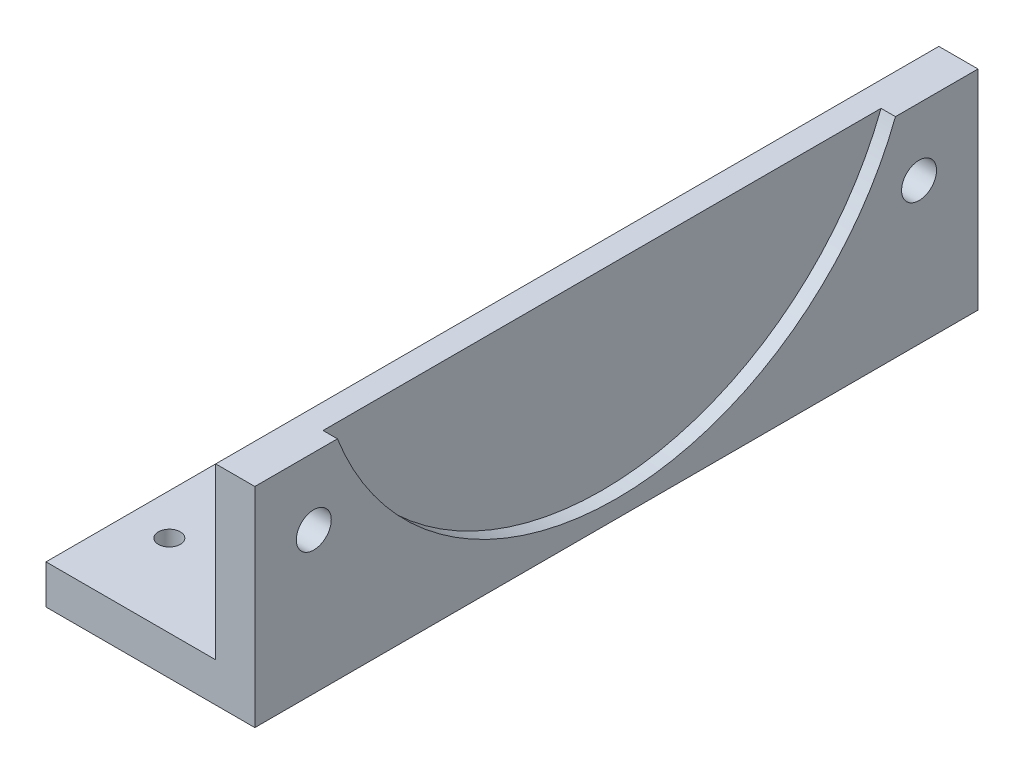
ISO-10303-21;
HEADER;
FILE_DESCRIPTION(('STEP AP214'),'2;1');
FILE_NAME('part.step','',(''),(''),'','','');
FILE_SCHEMA(('AUTOMOTIVE_DESIGN { 1 0 10303 214 1 1 1 1 }'));
ENDSEC;
DATA;
#1=APPLICATION_CONTEXT('core data for automotive mechanical design processes');
#2=APPLICATION_PROTOCOL_DEFINITION('international standard','automotive_design',2000,#1);
#3=PRODUCT_CONTEXT('',#1,'mechanical');
#4=PRODUCT('Part','Part','',(#3));
#5=PRODUCT_RELATED_PRODUCT_CATEGORY('part','',(#4));
#6=PRODUCT_DEFINITION_FORMATION('','',#4);
#7=PRODUCT_DEFINITION_CONTEXT('part definition',#1,'design');
#8=PRODUCT_DEFINITION('design','',#6,#7);
#9=PRODUCT_DEFINITION_SHAPE('','',#8);
#10=(LENGTH_UNIT() NAMED_UNIT(*) SI_UNIT(.MILLI.,.METRE.));
#11=(NAMED_UNIT(*) PLANE_ANGLE_UNIT() SI_UNIT($,.RADIAN.));
#12=(NAMED_UNIT(*) SI_UNIT($,.STERADIAN.) SOLID_ANGLE_UNIT());
#13=UNCERTAINTY_MEASURE_WITH_UNIT(LENGTH_MEASURE(1.E-05),#10,'distance_accuracy_value','');
#14=(GEOMETRIC_REPRESENTATION_CONTEXT(3) GLOBAL_UNCERTAINTY_ASSIGNED_CONTEXT((#13)) GLOBAL_UNIT_ASSIGNED_CONTEXT((#10,
#11,#12)) REPRESENTATION_CONTEXT('',''));
#15=CARTESIAN_POINT('',(0.,0.,0.));
#16=DIRECTION('',(0.,0.,1.));
#17=DIRECTION('',(1.,0.,0.));
#18=AXIS2_PLACEMENT_3D('',#15,#16,#17);
#19=CARTESIAN_POINT('',(25.4,-25.4,190.));
#20=DIRECTION('',(-1.,0.,0.));
#21=DIRECTION('',(0.,0.,1.));
#22=AXIS2_PLACEMENT_3D('',#19,#20,#21);
#23=PLANE('',#22);
#24=CARTESIAN_POINT('',(25.4000000000001,9.0999999999995,168.612159321677));
#25=DIRECTION('',(1.,0.,0.));
#26=DIRECTION('',(0.,0.,-1.));
#27=AXIS2_PLACEMENT_3D('',#24,#25,#26);
#28=CIRCLE('',#27,4.25);
#29=CARTESIAN_POINT('',(25.4000000000001,9.0999999999995,164.362159321677));
#30=VERTEX_POINT('',#29);
#31=EDGE_CURVE('E221',#30,#30,#28,.T.);
#32=ORIENTED_EDGE('',*,*,#31,.F.);
#33=EDGE_LOOP('',(#32));
#34=FACE_BOUND('',#33,.T.);
#35=DIRECTION('',(0.,-1.,0.));
#36=VECTOR('',#35,1.);
#37=CARTESIAN_POINT('',(25.4,25.4,7.04999999999997));
#38=LINE('',#37,#36);
#39=CARTESIAN_POINT('',(25.4,25.4,7.04999999999997));
#40=VERTEX_POINT('',#39);
#41=CARTESIAN_POINT('',(25.4,-25.4,7.04999999999999));
#42=VERTEX_POINT('',#41);
#43=EDGE_CURVE('E60',#40,#42,#38,.T.);
#44=ORIENTED_EDGE('',*,*,#43,.F.);
#45=DIRECTION('',(0.,0.,-1.));
#46=VECTOR('',#45,1.);
#47=CARTESIAN_POINT('',(25.4000000000001,25.3999999999999,190.));
#48=LINE('',#47,#46);
#49=CARTESIAN_POINT('',(25.4,25.3999999999999,27.1315795085813));
#50=VERTEX_POINT('',#49);
#51=EDGE_CURVE('E128',#50,#40,#48,.T.);
#52=ORIENTED_EDGE('',*,*,#51,.F.);
#53=CARTESIAN_POINT('',(25.4,51.5999999999998,95.));
#54=DIRECTION('',(1.,0.,0.));
#55=DIRECTION('',(0.,0.,-1.));
#56=AXIS2_PLACEMENT_3D('',#53,#54,#55);
#57=CIRCLE('',#56,72.75);
#58=CARTESIAN_POINT('',(25.4000000000001,25.3999999999999,162.868420491418));
#59=VERTEX_POINT('',#58);
#60=EDGE_CURVE('E157',#59,#50,#57,.T.);
#61=ORIENTED_EDGE('',*,*,#60,.F.);
#62=CARTESIAN_POINT('',(25.4000000000001,25.3999999999999,182.95));
#63=VERTEX_POINT('',#62);
#64=EDGE_CURVE('E137',#63,#59,#48,.T.);
#65=ORIENTED_EDGE('',*,*,#64,.F.);
#66=DIRECTION('',(0.,1.,0.));
#67=VECTOR('',#66,1.);
#68=CARTESIAN_POINT('',(25.4000000000001,-25.4,182.95));
#69=LINE('',#68,#67);
#70=CARTESIAN_POINT('',(25.4000000000001,-25.4,182.95));
#71=VERTEX_POINT('',#70);
#72=EDGE_CURVE('E190',#71,#63,#69,.T.);
#73=ORIENTED_EDGE('',*,*,#72,.F.);
#74=DIRECTION('',(0.,0.,-1.));
#75=VECTOR('',#74,1.);
#76=CARTESIAN_POINT('',(25.4,-25.4,190.));
#77=LINE('',#76,#75);
#78=EDGE_CURVE('E131',#71,#42,#77,.T.);
#79=ORIENTED_EDGE('',*,*,#78,.T.);
#80=EDGE_LOOP('',(#44,#52,#61,#65,#73,#79));
#81=FACE_BOUND('',#80,.T.);
#82=CARTESIAN_POINT('',(25.4000000000001,9.10000000000052,21.3878406783223));
#83=DIRECTION('',(1.,0.,0.));
#84=DIRECTION('',(0.,0.,-1.));
#85=AXIS2_PLACEMENT_3D('',#82,#83,#84);
#86=CIRCLE('',#85,4.25);
#87=CARTESIAN_POINT('',(25.4000000000001,9.10000000000052,17.1378406783223));
#88=VERTEX_POINT('',#87);
#89=EDGE_CURVE('E214',#88,#88,#86,.T.);
#90=ORIENTED_EDGE('',*,*,#89,.F.);
#91=EDGE_LOOP('',(#90));
#92=FACE_BOUND('',#91,.T.);
#93=ADVANCED_FACE('F46',(#34,#81,#92),#23,.F.);
#94=CARTESIAN_POINT('',(15.875,25.3999999999999,190.));
#95=DIRECTION('',(0.,-1.,0.));
#96=DIRECTION('',(0.,0.,-1.));
#97=AXIS2_PLACEMENT_3D('',#94,#95,#96);
#98=PLANE('',#97);
#99=DIRECTION('',(1.,0.,0.));
#100=VECTOR('',#99,1.);
#101=CARTESIAN_POINT('',(15.8750000000001,25.3999999999999,7.04999999999996));
#102=LINE('',#101,#100);
#103=CARTESIAN_POINT('',(15.8750000000001,25.3999999999999,7.04999999999996));
#104=VERTEX_POINT('',#103);
#105=EDGE_CURVE('E113',#104,#40,#102,.T.);
#106=ORIENTED_EDGE('',*,*,#105,.F.);
#107=DIRECTION('',(0.,0.,-1.));
#108=VECTOR('',#107,1.);
#109=CARTESIAN_POINT('',(15.875,25.3999999999999,190.));
#110=LINE('',#109,#108);
#111=CARTESIAN_POINT('',(15.875,25.3999999999999,182.95));
#112=VERTEX_POINT('',#111);
#113=EDGE_CURVE('E138',#112,#104,#110,.T.);
#114=ORIENTED_EDGE('',*,*,#113,.F.);
#115=DIRECTION('',(-1.,0.,0.));
#116=VECTOR('',#115,1.);
#117=CARTESIAN_POINT('',(25.4000000000001,25.3999999999999,182.95));
#118=LINE('',#117,#116);
#119=EDGE_CURVE('E198',#63,#112,#118,.T.);
#120=ORIENTED_EDGE('',*,*,#119,.F.);
#121=ORIENTED_EDGE('',*,*,#64,.T.);
#122=DIRECTION('',(1.,0.,0.));
#123=VECTOR('',#122,1.);
#124=CARTESIAN_POINT('',(21.9,25.3999999999999,162.868420491418));
#125=LINE('',#124,#123);
#126=CARTESIAN_POINT('',(21.9,25.3999999999999,162.868420491418));
#127=VERTEX_POINT('',#126);
#128=EDGE_CURVE('E53',#59,#127,#125,.F.);
#129=ORIENTED_EDGE('',*,*,#128,.T.);
#130=DIRECTION('',(0.,0.,1.));
#131=VECTOR('',#130,1.);
#132=CARTESIAN_POINT('',(21.9,25.3999999999999,190.));
#133=LINE('',#132,#131);
#134=CARTESIAN_POINT('',(21.9,25.3999999999999,27.1315795085813));
#135=VERTEX_POINT('',#134);
#136=EDGE_CURVE('E141',#135,#127,#133,.T.);
#137=ORIENTED_EDGE('',*,*,#136,.F.);
#138=DIRECTION('',(1.,0.,0.));
#139=VECTOR('',#138,1.);
#140=CARTESIAN_POINT('',(21.9,25.3999999999999,27.1315795085813));
#141=LINE('',#140,#139);
#142=EDGE_CURVE('E11',#135,#50,#141,.T.);
#143=ORIENTED_EDGE('',*,*,#142,.T.);
#144=ORIENTED_EDGE('',*,*,#51,.T.);
#145=EDGE_LOOP('',(#106,#114,#120,#121,#129,#137,#143,#144));
#146=FACE_BOUND('',#145,.T.);
#147=ADVANCED_FACE('F134',(#146),#98,.F.);
#148=CARTESIAN_POINT('',(15.875,25.3999999999999,190.));
#149=DIRECTION('',(1.,0.,0.));
#150=DIRECTION('',(0.,0.999999999999999,0.));
#151=AXIS2_PLACEMENT_3D('',#148,#149,#150);
#152=PLANE('',#151);
#153=CARTESIAN_POINT('',(15.8750000000001,9.09999999999943,168.612159321677));
#154=DIRECTION('',(1.,0.,0.));
#155=DIRECTION('',(0.,0.999999999999999,0.));
#156=AXIS2_PLACEMENT_3D('',#153,#154,#155);
#157=CIRCLE('',#156,4.25);
#158=CARTESIAN_POINT('',(15.8750000000001,13.3499999999994,168.612159321677));
#159=VERTEX_POINT('',#158);
#160=EDGE_CURVE('E217',#159,#159,#157,.T.);
#161=ORIENTED_EDGE('',*,*,#160,.T.);
#162=EDGE_LOOP('',(#161));
#163=FACE_BOUND('',#162,.T.);
#164=CARTESIAN_POINT('',(15.8750000000001,9.10000000000051,21.3878406783223));
#165=DIRECTION('',(1.,0.,0.));
#166=DIRECTION('',(0.,0.999999999999999,0.));
#167=AXIS2_PLACEMENT_3D('',#164,#165,#166);
#168=CIRCLE('',#167,4.25);
#169=CARTESIAN_POINT('',(15.8750000000001,13.3500000000005,21.3878406783223));
#170=VERTEX_POINT('',#169);
#171=EDGE_CURVE('E121',#170,#170,#168,.T.);
#172=ORIENTED_EDGE('',*,*,#171,.T.);
#173=EDGE_LOOP('',(#172));
#174=FACE_BOUND('',#173,.T.);
#175=DIRECTION('',(0.,0.999999999999999,0.));
#176=VECTOR('',#175,1.);
#177=CARTESIAN_POINT('',(15.875,-15.875,7.04999999999999));
#178=LINE('',#177,#176);
#179=CARTESIAN_POINT('',(15.875,-15.875,7.04999999999999));
#180=VERTEX_POINT('',#179);
#181=EDGE_CURVE('E116',#180,#104,#178,.T.);
#182=ORIENTED_EDGE('',*,*,#181,.F.);
#183=DIRECTION('',(0.,0.,-1.));
#184=VECTOR('',#183,1.);
#185=CARTESIAN_POINT('',(15.875,-15.875,190.));
#186=LINE('',#185,#184);
#187=CARTESIAN_POINT('',(15.875,-15.875,182.95));
#188=VERTEX_POINT('',#187);
#189=EDGE_CURVE('E143',#188,#180,#186,.T.);
#190=ORIENTED_EDGE('',*,*,#189,.F.);
#191=DIRECTION('',(0.,-0.999999999999999,0.));
#192=VECTOR('',#191,1.);
#193=CARTESIAN_POINT('',(15.875,25.3999999999999,182.95));
#194=LINE('',#193,#192);
#195=EDGE_CURVE('E187',#112,#188,#194,.T.);
#196=ORIENTED_EDGE('',*,*,#195,.F.);
#197=ORIENTED_EDGE('',*,*,#113,.T.);
#198=EDGE_LOOP('',(#182,#190,#196,#197));
#199=FACE_BOUND('',#198,.T.);
#200=ADVANCED_FACE('F186',(#163,#174,#199),#152,.F.);
#201=CARTESIAN_POINT('',(-25.4000000000001,-15.875,190.));
#202=DIRECTION('',(0.,-1.,0.));
#203=DIRECTION('',(0.,0.,-1.));
#204=AXIS2_PLACEMENT_3D('',#201,#202,#203);
#205=PLANE('',#204);
#206=CARTESIAN_POINT('',(-15.4000000000001,-15.875,27.0499999999999));
#207=DIRECTION('',(0.,1.,0.));
#208=DIRECTION('',(0.,0.,1.));
#209=AXIS2_PLACEMENT_3D('',#206,#207,#208);
#210=CIRCLE('',#209,2.665);
#211=CARTESIAN_POINT('',(-15.4000000000001,-15.875,29.715));
#212=VERTEX_POINT('',#211);
#213=EDGE_CURVE('E238',#212,#212,#210,.T.);
#214=ORIENTED_EDGE('',*,*,#213,.F.);
#215=EDGE_LOOP('',(#214));
#216=FACE_BOUND('',#215,.T.);
#217=CARTESIAN_POINT('',(4.59999999999994,-15.875,95.));
#218=DIRECTION('',(0.,1.,0.));
#219=DIRECTION('',(0.,0.,1.));
#220=AXIS2_PLACEMENT_3D('',#217,#218,#219);
#221=CIRCLE('',#220,2.665);
#222=CARTESIAN_POINT('',(4.59999999999994,-15.875,97.665));
#223=VERTEX_POINT('',#222);
#224=EDGE_CURVE('E230',#223,#223,#221,.T.);
#225=ORIENTED_EDGE('',*,*,#224,.F.);
#226=EDGE_LOOP('',(#225));
#227=FACE_BOUND('',#226,.T.);
#228=CARTESIAN_POINT('',(-15.4000000000001,-15.8750000000001,162.95));
#229=DIRECTION('',(0.,1.,0.));
#230=DIRECTION('',(0.,0.,-1.));
#231=AXIS2_PLACEMENT_3D('',#228,#229,#230);
#232=CIRCLE('',#231,2.66500000000001);
#233=CARTESIAN_POINT('',(-15.4000000000001,-15.8750000000001,160.285));
#234=VERTEX_POINT('',#233);
#235=EDGE_CURVE('E231',#234,#234,#232,.T.);
#236=ORIENTED_EDGE('',*,*,#235,.F.);
#237=EDGE_LOOP('',(#236));
#238=FACE_BOUND('',#237,.T.);
#239=DIRECTION('',(1.,0.,0.));
#240=VECTOR('',#239,1.);
#241=CARTESIAN_POINT('',(-25.3999999999999,-15.875,7.05000000000001));
#242=LINE('',#241,#240);
#243=CARTESIAN_POINT('',(-25.3999999999999,-15.875,7.05000000000001));
#244=VERTEX_POINT('',#243);
#245=EDGE_CURVE('E183',#244,#180,#242,.T.);
#246=ORIENTED_EDGE('',*,*,#245,.F.);
#247=DIRECTION('',(0.,0.,-1.));
#248=VECTOR('',#247,1.);
#249=CARTESIAN_POINT('',(-25.4000000000001,-15.875,190.));
#250=LINE('',#249,#248);
#251=CARTESIAN_POINT('',(-25.4,-15.875,182.95));
#252=VERTEX_POINT('',#251);
#253=EDGE_CURVE('E172',#252,#244,#250,.T.);
#254=ORIENTED_EDGE('',*,*,#253,.F.);
#255=DIRECTION('',(-1.,0.,0.));
#256=VECTOR('',#255,1.);
#257=CARTESIAN_POINT('',(15.875,-15.875,182.95));
#258=LINE('',#257,#256);
#259=EDGE_CURVE('E164',#188,#252,#258,.T.);
#260=ORIENTED_EDGE('',*,*,#259,.F.);
#261=ORIENTED_EDGE('',*,*,#189,.T.);
#262=EDGE_LOOP('',(#246,#254,#260,#261));
#263=FACE_BOUND('',#262,.T.);
#264=ADVANCED_FACE('F181',(#216,#227,#238,#263),#205,.F.);
#265=CARTESIAN_POINT('',(-25.4,-25.4,190.));
#266=DIRECTION('',(1.,0.,0.));
#267=DIRECTION('',(0.,0.999999999999999,0.));
#268=AXIS2_PLACEMENT_3D('',#265,#266,#267);
#269=PLANE('',#268);
#270=DIRECTION('',(0.,0.999999999999999,0.));
#271=VECTOR('',#270,1.);
#272=CARTESIAN_POINT('',(-25.3999999999999,-25.4,7.04999999999999));
#273=LINE('',#272,#271);
#274=CARTESIAN_POINT('',(-25.3999999999999,-25.4,7.04999999999999));
#275=VERTEX_POINT('',#274);
#276=EDGE_CURVE('E192',#275,#244,#273,.T.);
#277=ORIENTED_EDGE('',*,*,#276,.F.);
#278=DIRECTION('',(0.,0.,-1.));
#279=VECTOR('',#278,1.);
#280=CARTESIAN_POINT('',(-25.4,-25.4,190.));
#281=LINE('',#280,#279);
#282=CARTESIAN_POINT('',(-25.4,-25.4,182.95));
#283=VERTEX_POINT('',#282);
#284=EDGE_CURVE('E168',#283,#275,#281,.T.);
#285=ORIENTED_EDGE('',*,*,#284,.F.);
#286=DIRECTION('',(0.,-0.999999999999999,0.));
#287=VECTOR('',#286,1.);
#288=CARTESIAN_POINT('',(-25.4,-15.875,182.95));
#289=LINE('',#288,#287);
#290=EDGE_CURVE('E68',#252,#283,#289,.T.);
#291=ORIENTED_EDGE('',*,*,#290,.F.);
#292=ORIENTED_EDGE('',*,*,#253,.T.);
#293=EDGE_LOOP('',(#277,#285,#291,#292));
#294=FACE_BOUND('',#293,.T.);
#295=ADVANCED_FACE('F207',(#294),#269,.F.);
#296=CARTESIAN_POINT('',(-25.4,-25.4,190.));
#297=DIRECTION('',(0.,1.,0.));
#298=DIRECTION('',(0.,0.,1.));
#299=AXIS2_PLACEMENT_3D('',#296,#297,#298);
#300=PLANE('',#299);
#301=CARTESIAN_POINT('',(-15.4000000000001,-25.4,27.05));
#302=DIRECTION('',(0.,1.,0.));
#303=DIRECTION('',(0.,0.,1.));
#304=AXIS2_PLACEMENT_3D('',#301,#302,#303);
#305=CIRCLE('',#304,2.665);
#306=CARTESIAN_POINT('',(-15.4000000000001,-25.4,29.715));
#307=VERTEX_POINT('',#306);
#308=EDGE_CURVE('E225',#307,#307,#305,.F.);
#309=ORIENTED_EDGE('',*,*,#308,.F.);
#310=EDGE_LOOP('',(#309));
#311=FACE_BOUND('',#310,.T.);
#312=CARTESIAN_POINT('',(4.59999999999994,-25.4,95.));
#313=DIRECTION('',(0.,1.,0.));
#314=DIRECTION('',(0.,0.,1.));
#315=AXIS2_PLACEMENT_3D('',#312,#313,#314);
#316=CIRCLE('',#315,2.665);
#317=CARTESIAN_POINT('',(4.59999999999994,-25.4,97.665));
#318=VERTEX_POINT('',#317);
#319=EDGE_CURVE('E235',#318,#318,#316,.F.);
#320=ORIENTED_EDGE('',*,*,#319,.F.);
#321=EDGE_LOOP('',(#320));
#322=FACE_BOUND('',#321,.T.);
#323=CARTESIAN_POINT('',(-15.4000000000001,-25.4,162.95));
#324=DIRECTION('',(0.,1.,0.));
#325=DIRECTION('',(0.,0.,1.));
#326=AXIS2_PLACEMENT_3D('',#323,#324,#325);
#327=CIRCLE('',#326,2.66500000000001);
#328=CARTESIAN_POINT('',(-15.4000000000001,-25.4,165.615));
#329=VERTEX_POINT('',#328);
#330=EDGE_CURVE('E226',#329,#329,#327,.F.);
#331=ORIENTED_EDGE('',*,*,#330,.F.);
#332=EDGE_LOOP('',(#331));
#333=FACE_BOUND('',#332,.T.);
#334=DIRECTION('',(-1.,0.,0.));
#335=VECTOR('',#334,1.);
#336=CARTESIAN_POINT('',(25.4,-25.4,7.04999999999999));
#337=LINE('',#336,#335);
#338=EDGE_CURVE('E132',#42,#275,#337,.T.);
#339=ORIENTED_EDGE('',*,*,#338,.F.);
#340=ORIENTED_EDGE('',*,*,#78,.F.);
#341=DIRECTION('',(1.,0.,0.));
#342=VECTOR('',#341,1.);
#343=CARTESIAN_POINT('',(-25.4,-25.4,182.95));
#344=LINE('',#343,#342);
#345=EDGE_CURVE('E188',#283,#71,#344,.T.);
#346=ORIENTED_EDGE('',*,*,#345,.F.);
#347=ORIENTED_EDGE('',*,*,#284,.T.);
#348=EDGE_LOOP('',(#339,#340,#346,#347));
#349=FACE_BOUND('',#348,.T.);
#350=ADVANCED_FACE('F209',(#311,#322,#333,#349),#300,.F.);
#351=CARTESIAN_POINT('',(21.9,51.5999999999998,94.9999999999999));
#352=DIRECTION('',(1.,0.,0.));
#353=DIRECTION('',(0.,0.,-1.));
#354=AXIS2_PLACEMENT_3D('',#351,#352,#353);
#355=CYLINDRICAL_SURFACE('',#354,72.75);
#356=CARTESIAN_POINT('',(21.9,51.5999999999998,94.9999999999999));
#357=DIRECTION('',(1.,0.,0.));
#358=DIRECTION('',(0.,0.,-1.));
#359=AXIS2_PLACEMENT_3D('',#356,#357,#358);
#360=CIRCLE('',#359,72.75);
#361=EDGE_CURVE('E158',#127,#135,#360,.T.);
#362=ORIENTED_EDGE('',*,*,#361,.F.);
#363=ORIENTED_EDGE('',*,*,#128,.F.);
#364=ORIENTED_EDGE('',*,*,#60,.T.);
#365=ORIENTED_EDGE('',*,*,#142,.F.);
#366=EDGE_LOOP('',(#362,#363,#364,#365));
#367=FACE_BOUND('',#366,.T.);
#368=ADVANCED_FACE('F156',(#367),#355,.F.);
#369=CARTESIAN_POINT('',(21.9,51.5999999999998,94.9999999999999));
#370=DIRECTION('',(1.,0.,0.));
#371=DIRECTION('',(0.,0.,-1.));
#372=AXIS2_PLACEMENT_3D('',#369,#370,#371);
#373=PLANE('',#372);
#374=ORIENTED_EDGE('',*,*,#136,.T.);
#375=ORIENTED_EDGE('',*,*,#361,.T.);
#376=EDGE_LOOP('',(#374,#375));
#377=FACE_BOUND('',#376,.T.);
#378=ADVANCED_FACE('F273',(#377),#373,.T.);
#379=CARTESIAN_POINT('',(0.,0.,182.95));
#380=DIRECTION('',(0.,0.,1.));
#381=DIRECTION('',(1.,0.,0.));
#382=AXIS2_PLACEMENT_3D('',#379,#380,#381);
#383=PLANE('',#382);
#384=ORIENTED_EDGE('',*,*,#345,.T.);
#385=ORIENTED_EDGE('',*,*,#72,.T.);
#386=ORIENTED_EDGE('',*,*,#119,.T.);
#387=ORIENTED_EDGE('',*,*,#195,.T.);
#388=ORIENTED_EDGE('',*,*,#259,.T.);
#389=ORIENTED_EDGE('',*,*,#290,.T.);
#390=EDGE_LOOP('',(#384,#385,#386,#387,#388,#389));
#391=FACE_BOUND('',#390,.T.);
#392=ADVANCED_FACE('F203',(#391),#383,.T.);
#393=CARTESIAN_POINT('',(0.,0.,7.04999999999996));
#394=DIRECTION('',(0.,0.,-1.));
#395=DIRECTION('',(-1.,0.,0.));
#396=AXIS2_PLACEMENT_3D('',#393,#394,#395);
#397=PLANE('',#396);
#398=ORIENTED_EDGE('',*,*,#105,.T.);
#399=ORIENTED_EDGE('',*,*,#43,.T.);
#400=ORIENTED_EDGE('',*,*,#338,.T.);
#401=ORIENTED_EDGE('',*,*,#276,.T.);
#402=ORIENTED_EDGE('',*,*,#245,.T.);
#403=ORIENTED_EDGE('',*,*,#181,.T.);
#404=EDGE_LOOP('',(#398,#399,#400,#401,#402,#403));
#405=FACE_BOUND('',#404,.T.);
#406=ADVANCED_FACE('F114',(#405),#397,.T.);
#407=CARTESIAN_POINT('',(25.4000000000001,9.10000000000052,21.3878406783223));
#408=DIRECTION('',(1.,0.,0.));
#409=DIRECTION('',(0.,0.,-1.));
#410=AXIS2_PLACEMENT_3D('',#407,#408,#409);
#411=CYLINDRICAL_SURFACE('',#410,4.25);
#412=ORIENTED_EDGE('',*,*,#171,.F.);
#413=EDGE_LOOP('',(#412));
#414=FACE_BOUND('',#413,.T.);
#415=ORIENTED_EDGE('',*,*,#89,.T.);
#416=EDGE_LOOP('',(#415));
#417=FACE_BOUND('',#416,.T.);
#418=ADVANCED_FACE('F286',(#414,#417),#411,.F.);
#419=CARTESIAN_POINT('',(25.4000000000001,9.0999999999995,168.612159321677));
#420=DIRECTION('',(1.,0.,0.));
#421=DIRECTION('',(0.,0.,-1.));
#422=AXIS2_PLACEMENT_3D('',#419,#420,#421);
#423=CYLINDRICAL_SURFACE('',#422,4.25);
#424=ORIENTED_EDGE('',*,*,#160,.F.);
#425=EDGE_LOOP('',(#424));
#426=FACE_BOUND('',#425,.T.);
#427=ORIENTED_EDGE('',*,*,#31,.T.);
#428=EDGE_LOOP('',(#427));
#429=FACE_BOUND('',#428,.T.);
#430=ADVANCED_FACE('F262',(#426,#429),#423,.F.);
#431=CARTESIAN_POINT('',(-15.4000000000001,-25.4010000000001,162.95));
#432=DIRECTION('',(0.,1.,0.));
#433=DIRECTION('',(0.,0.,1.));
#434=AXIS2_PLACEMENT_3D('',#431,#432,#433);
#435=CYLINDRICAL_SURFACE('',#434,2.66500000000001);
#436=ORIENTED_EDGE('',*,*,#235,.T.);
#437=EDGE_LOOP('',(#436));
#438=FACE_BOUND('',#437,.T.);
#439=ORIENTED_EDGE('',*,*,#330,.T.);
#440=EDGE_LOOP('',(#439));
#441=FACE_BOUND('',#440,.T.);
#442=ADVANCED_FACE('F258',(#438,#441),#435,.F.);
#443=CARTESIAN_POINT('',(4.59999999999994,-25.401,95.));
#444=DIRECTION('',(0.,1.,0.));
#445=DIRECTION('',(0.,0.,1.));
#446=AXIS2_PLACEMENT_3D('',#443,#444,#445);
#447=CYLINDRICAL_SURFACE('',#446,2.665);
#448=ORIENTED_EDGE('',*,*,#224,.T.);
#449=EDGE_LOOP('',(#448));
#450=FACE_BOUND('',#449,.T.);
#451=ORIENTED_EDGE('',*,*,#319,.T.);
#452=EDGE_LOOP('',(#451));
#453=FACE_BOUND('',#452,.T.);
#454=ADVANCED_FACE('F261',(#450,#453),#447,.F.);
#455=CARTESIAN_POINT('',(-15.4000000000001,-25.4010000000001,27.0499999999999));
#456=DIRECTION('',(0.,1.,0.));
#457=DIRECTION('',(0.,0.,1.));
#458=AXIS2_PLACEMENT_3D('',#455,#456,#457);
#459=CYLINDRICAL_SURFACE('',#458,2.665);
#460=ORIENTED_EDGE('',*,*,#213,.T.);
#461=EDGE_LOOP('',(#460));
#462=FACE_BOUND('',#461,.T.);
#463=ORIENTED_EDGE('',*,*,#308,.T.);
#464=EDGE_LOOP('',(#463));
#465=FACE_BOUND('',#464,.T.);
#466=ADVANCED_FACE('F248',(#462,#465),#459,.F.);
#467=CLOSED_SHELL('',(#93,#147,#200,#264,#295,#350,#368,#378,#392,#406,#418,#430,#442,#454,#466));
#468=MANIFOLD_SOLID_BREP('B2',#467);
#469=ADVANCED_BREP_SHAPE_REPRESENTATION('',(#18,#468),#14);
#470=SHAPE_DEFINITION_REPRESENTATION(#9,#469);
ENDSEC;
END-ISO-10303-21;
